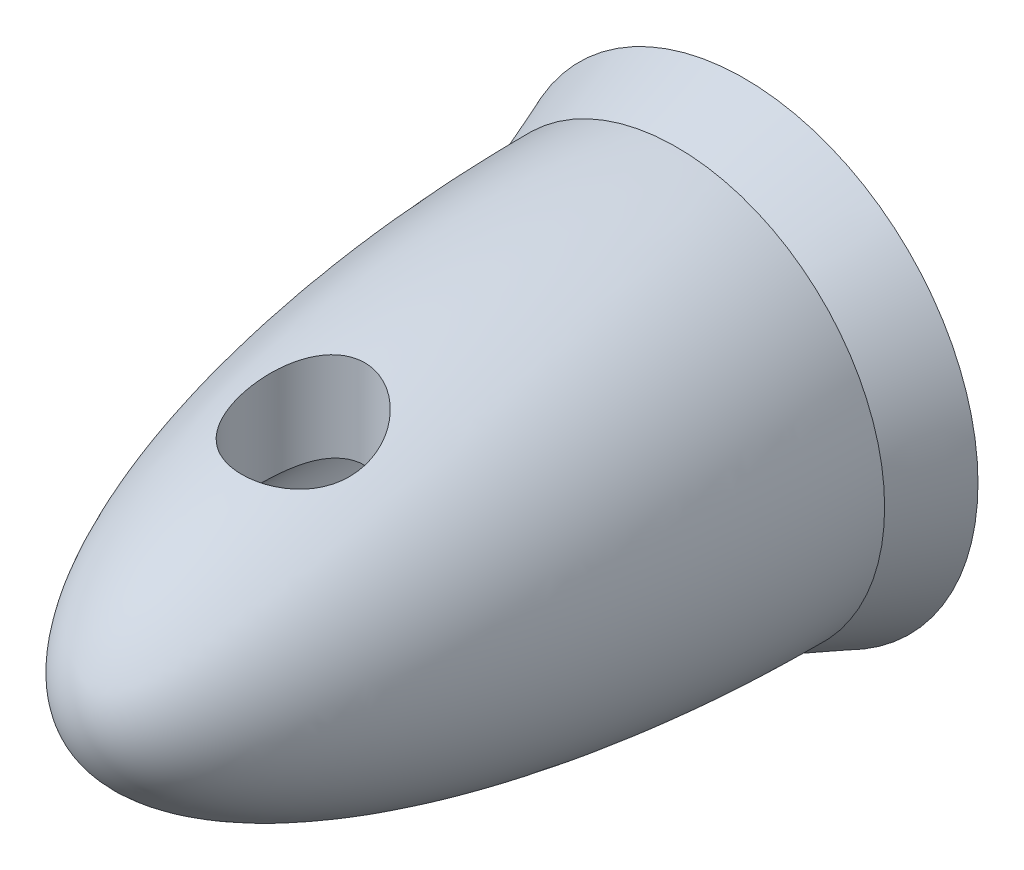
ISO-10303-21;
HEADER;
FILE_DESCRIPTION(('STEP AP214'),'2;1');
FILE_NAME('part.step','',(''),(''),'','','');
FILE_SCHEMA(('AUTOMOTIVE_DESIGN { 1 0 10303 214 1 1 1 1 }'));
ENDSEC;
DATA;
#1=APPLICATION_CONTEXT('core data for automotive mechanical design processes');
#2=APPLICATION_PROTOCOL_DEFINITION('international standard','automotive_design',2000,#1);
#3=PRODUCT_CONTEXT('',#1,'mechanical');
#4=PRODUCT('Part','Part','',(#3));
#5=PRODUCT_RELATED_PRODUCT_CATEGORY('part','',(#4));
#6=PRODUCT_DEFINITION_FORMATION('','',#4);
#7=PRODUCT_DEFINITION_CONTEXT('part definition',#1,'design');
#8=PRODUCT_DEFINITION('design','',#6,#7);
#9=PRODUCT_DEFINITION_SHAPE('','',#8);
#10=(LENGTH_UNIT() NAMED_UNIT(*) SI_UNIT(.MILLI.,.METRE.));
#11=(NAMED_UNIT(*) PLANE_ANGLE_UNIT() SI_UNIT($,.RADIAN.));
#12=(NAMED_UNIT(*) SI_UNIT($,.STERADIAN.) SOLID_ANGLE_UNIT());
#13=UNCERTAINTY_MEASURE_WITH_UNIT(LENGTH_MEASURE(1.E-05),#10,'distance_accuracy_value','');
#14=(GEOMETRIC_REPRESENTATION_CONTEXT(3) GLOBAL_UNCERTAINTY_ASSIGNED_CONTEXT((#13)) GLOBAL_UNIT_ASSIGNED_CONTEXT((#10,
#11,#12)) REPRESENTATION_CONTEXT('',''));
#15=CARTESIAN_POINT('',(0.,0.,0.));
#16=DIRECTION('',(0.,0.,1.));
#17=DIRECTION('',(1.,0.,0.));
#18=AXIS2_PLACEMENT_3D('',#15,#16,#17);
#19=CARTESIAN_POINT('',(0.,-5.8802,11.0998));
#20=DIRECTION('',(0.,1.,0.));
#21=DIRECTION('',(0.,0.,1.));
#22=AXIS2_PLACEMENT_3D('',#19,#20,#21);
#23=CYLINDRICAL_SURFACE('',#22,1.5494);
#24=CARTESIAN_POINT('',(0.,-2.2225,12.6492));
#25=CARTESIAN_POINT('',(0.0771170147032911,-2.22250274735584,12.6492029894743));
#26=CARTESIAN_POINT('',(0.15421870157436,-2.21845361360843,12.6434120716821));
#27=CARTESIAN_POINT('',(0.305938755659869,-2.20266390543856,12.6206318512073));
#28=CARTESIAN_POINT('',(0.380556262324024,-2.19092069423566,12.603638709481));
#29=CARTESIAN_POINT('',(0.524879470134859,-2.16088481343655,12.5595313730395));
#30=CARTESIAN_POINT('',(0.594607037004107,-2.14262386489485,12.5324661711082));
#31=CARTESIAN_POINT('',(0.728199152998337,-2.10098412662809,12.4694088378081));
#32=CARTESIAN_POINT('',(0.792062853926654,-2.07760459816065,12.4334154177686));
#33=CARTESIAN_POINT('',(0.918474233362047,-2.02509220899793,12.3501090592354));
#34=CARTESIAN_POINT('',(0.980410908685875,-1.99563402364824,12.3020784851358));
#35=CARTESIAN_POINT('',(1.09590864070643,-1.93462323976061,12.1978385785166));
#36=CARTESIAN_POINT('',(1.14945695029351,-1.90306755549934,12.1416170443341));
#37=CARTESIAN_POINT('',(1.25624066297551,-1.83467827368051,12.0112793859312));
#38=CARTESIAN_POINT('',(1.30779117464696,-1.79788447718598,11.9357525909791));
#39=CARTESIAN_POINT('',(1.39748918760828,-1.72908067290491,11.7751447630681));
#40=CARTESIAN_POINT('',(1.43565922265104,-1.69706267507141,11.6900801146551));
#41=CARTESIAN_POINT('',(1.48722085116729,-1.65180969579788,11.539175875003));
#42=CARTESIAN_POINT('',(1.5046252740562,-1.635828582297,11.4755408943984));
#43=CARTESIAN_POINT('',(1.53126521925815,-1.61092269960599,11.3452920824815));
#44=CARTESIAN_POINT('',(1.54051655385883,-1.60198427524698,11.2786842816316));
#45=CARTESIAN_POINT('',(1.5502553443447,-1.59256642124469,11.1438295837258));
#46=CARTESIAN_POINT('',(1.55069390265044,-1.59213418837216,11.0755756441042));
#47=CARTESIAN_POINT('',(1.54264193598977,-1.59993385322039,10.9400818702673));
#48=CARTESIAN_POINT('',(1.53414520214767,-1.6081717755841,10.8728427741902));
#49=CARTESIAN_POINT('',(1.509667932058,-1.63115365364257,10.7455687901461));
#50=CARTESIAN_POINT('',(1.49420100999816,-1.64544761456029,10.6853482193836));
#51=CARTESIAN_POINT('',(1.45670569797196,-1.67873267770151,10.5683601114957));
#52=CARTESIAN_POINT('',(1.43467207791442,-1.69772752192241,10.5115953703513));
#53=CARTESIAN_POINT('',(1.3715297612764,-1.74952264863319,10.3731676993877));
#54=CARTESIAN_POINT('',(1.32647625894424,-1.7843404940706,10.2940497865428));
#55=CARTESIAN_POINT('',(1.22389582236907,-1.85621266499247,10.145390065117));
#56=CARTESIAN_POINT('',(1.16634383118288,-1.89327137367421,10.075867958885));
#57=CARTESIAN_POINT('',(1.03882899868236,-1.96616363403802,9.94662957858762));
#58=CARTESIAN_POINT('',(0.968732391082036,-2.00197844714014,9.88703388194611));
#59=CARTESIAN_POINT('',(0.817478343778214,-2.06833804202416,9.78037086851881));
#60=CARTESIAN_POINT('',(0.736344382706881,-2.09889370666812,9.73327756793046));
#61=CARTESIAN_POINT('',(0.583635498281869,-2.1456402453397,9.66263701561687));
#62=CARTESIAN_POINT('',(0.513918959041067,-2.16351363567332,9.63618531807645));
#63=CARTESIAN_POINT('',(0.370127747273022,-2.19268728268332,9.59339399560098));
#64=CARTESIAN_POINT('',(0.296056079612801,-2.20399201420774,9.5770474860984));
#65=CARTESIAN_POINT('',(0.145242222996963,-2.21904776290085,9.55533597186037));
#66=CARTESIAN_POINT('',(0.0684906799491387,-2.22276890849082,9.55001439272634));
#67=CARTESIAN_POINT('',(-0.0849233265514331,-2.22220071663168,9.55082917795614));
#68=CARTESIAN_POINT('',(-0.161585792615044,-2.21791162020994,9.55696519756201));
#69=CARTESIAN_POINT('',(-0.307549914569856,-2.2022646726015,9.57954885931754));
#70=CARTESIAN_POINT('',(-0.377009956662267,-2.19137267079116,9.59531742489817));
#71=CARTESIAN_POINT('',(-0.512055085986602,-2.16380681479868,9.63576025052818));
#72=CARTESIAN_POINT('',(-0.577639449176778,-2.14713188424004,9.66043616853797));
#73=CARTESIAN_POINT('',(-0.708335435790631,-2.10778486168935,9.7197923560651));
#74=CARTESIAN_POINT('',(-0.773070585593601,-2.08476653205376,9.7550666066516));
#75=CARTESIAN_POINT('',(-0.895923380185302,-2.03500095557565,9.83359092141859));
#76=CARTESIAN_POINT('',(-0.954036697811736,-2.00825129552686,9.87684615312085));
#77=CARTESIAN_POINT('',(-1.07246412819102,-1.94793715947481,9.97839732835856));
#78=CARTESIAN_POINT('',(-1.13146202465086,-1.9139886497203,10.0380003066189));
#79=CARTESIAN_POINT('',(-1.23917675769554,-1.84607740859233,10.165946113086));
#80=CARTESIAN_POINT('',(-1.28788595324982,-1.81211468528764,10.2342953767597));
#81=CARTESIAN_POINT('',(-1.36975924887038,-1.75088652332061,10.3717053834742));
#82=CARTESIAN_POINT('',(-1.4040067278097,-1.72329152128733,10.4399704312431));
#83=CARTESIAN_POINT('',(-1.46254443380959,-1.67389987976446,10.582579881039));
#84=CARTESIAN_POINT('',(-1.48685416793899,-1.6520919105798,10.6569120261709));
#85=CARTESIAN_POINT('',(-1.52051787027009,-1.6210962163981,10.7953476844841));
#86=CARTESIAN_POINT('',(-1.5318727916681,-1.61027006948123,10.8585881820952));
#87=CARTESIAN_POINT('',(-1.54661532289652,-1.59611978699779,10.9867909884084));
#88=CARTESIAN_POINT('',(-1.5500127857186,-1.5927863740719,11.0517510669596));
#89=CARTESIAN_POINT('',(-1.54860392303485,-1.59415565405595,11.1815526005078));
#90=CARTESIAN_POINT('',(-1.54378998225525,-1.59886580659084,11.246393889502));
#91=CARTESIAN_POINT('',(-1.52629640069475,-1.6155695374302,11.3740755401818));
#92=CARTESIAN_POINT('',(-1.51360530246867,-1.62757372448263,11.4369128468209));
#93=CARTESIAN_POINT('',(-1.47636052882862,-1.66152435971457,11.576935905243));
#94=CARTESIAN_POINT('',(-1.44944030658933,-1.68534034814961,11.6530286690748));
#95=CARTESIAN_POINT('',(-1.38518410862201,-1.73853602374154,11.7985561296806));
#96=CARTESIAN_POINT('',(-1.34783202463406,-1.76792429256588,11.8679803046093));
#97=CARTESIAN_POINT('',(-1.26271332490164,-1.82972487297364,12.0012356780702));
#98=CARTESIAN_POINT('',(-1.21472401226484,-1.86219175047499,12.0648985484187));
#99=CARTESIAN_POINT('',(-1.10946601828289,-1.92676136421949,12.1842629029324));
#100=CARTESIAN_POINT('',(-1.05219426101847,-1.95886397596998,12.2399617365034));
#101=CARTESIAN_POINT('',(-0.917977600252162,-2.02568020681746,12.3515372835879));
#102=CARTESIAN_POINT('',(-0.839343993893815,-2.05986431615365,12.4057319752667));
#103=CARTESIAN_POINT('',(-0.671167744969847,-2.12061165916992,12.4995871211126));
#104=CARTESIAN_POINT('',(-0.581639750080523,-2.14718496785051,12.5392668093851));
#105=CARTESIAN_POINT('',(-0.410560566217402,-2.18569346735763,12.5960425770877));
#106=CARTESIAN_POINT('',(-0.330307223259771,-2.19936534925841,12.6158574118936));
#107=CARTESIAN_POINT('',(-0.166694204322206,-2.21776206998619,12.642427120274));
#108=CARTESIAN_POINT('',(-0.0833381518515855,-2.22249703101113,12.6491967693606));
#109=CARTESIAN_POINT('',(0.,-2.2225,12.6492));
#110=B_SPLINE_CURVE_WITH_KNOTS('',3,(#24,#25,#26,#27,#28,#29,#30,#31,#32,#33,#34,#35,#36,#37,
#38,#39,#40,#41,#42,#43,#44,#45,#46,#47,#48,#49,#50,#51,#52,#53,#54,#55,#56,#57,#58,#59,#60,#61,
#62,#63,#64,#65,#66,#67,#68,#69,#70,#71,#72,#73,#74,#75,#76,#77,#78,#79,#80,#81,#82,#83,#84,#85,
#86,#87,#88,#89,#90,#91,#92,#93,#94,#95,#96,#97,#98,#99,#100,#101,#102,#103,#104,#105,#106,#107,
#108,#109),.UNSPECIFIED.,.T.,.F.,(4,2,2,2,2,2,2,2,2,2,2,2,2,2,2,2,2,2,2,2,2,2,2,2,2,2,2,2,2,2,2,
2,2,2,2,2,2,2,2,2,2,2,4),(0.,0.23101475453498,0.462108719868971,0.692092980091046,
0.922110454848142,1.17238105520856,1.42302835712061,1.71741004919331,2.01129357085937,
2.21416389079127,2.41663988795183,2.62023901234306,2.82397970540837,3.01468460216281,
3.20554179488864,3.4964381214486,3.7879231105135,4.08272477988537,4.37690887784421,
4.60598590770751,4.83490669709368,5.06472747109976,5.29454132993396,5.50977140439178,
5.72504156114187,5.95586420126587,6.18683682214929,6.45721757828604,6.72779843545371,
6.97055897877779,7.21284068587513,7.40747819089864,7.60187456643702,7.79645132363593,
7.99131176105597,8.24241098704428,8.49390010988842,8.75125810362404,9.0087015529715,
9.31129577560797,9.61348755981758,9.86342184944642,10.1130728864772),.UNSPECIFIED.);
#111=CARTESIAN_POINT('',(0.,-2.2225,12.6492));
#112=VERTEX_POINT('',#111);
#113=EDGE_CURVE('E41',#112,#112,#110,.T.);
#114=ORIENTED_EDGE('',*,*,#113,.T.);
#115=EDGE_LOOP('',(#114));
#116=FACE_BOUND('',#115,.T.);
#117=CARTESIAN_POINT('',(0.,-3.57322495631313,12.6492));
#118=CARTESIAN_POINT('',(-0.0870657425102343,-3.57322371714071,12.6491982283351));
#119=CARTESIAN_POINT('',(-0.174150938474675,-3.57276235523512,12.6418411087649));
#120=CARTESIAN_POINT('',(-0.345869479929163,-3.57116369774129,12.6126140773961));
#121=CARTESIAN_POINT('',(-0.430501805618271,-3.57002612512371,12.5907382171456));
#122=CARTESIAN_POINT('',(-0.594884287338493,-3.56779544675727,12.5330958365612));
#123=CARTESIAN_POINT('',(-0.674635206419172,-3.56670233406755,12.4973314936932));
#124=CARTESIAN_POINT('',(-0.827008845724925,-3.56565319591999,12.4129190888639));
#125=CARTESIAN_POINT('',(-0.899631905239484,-3.56569711631244,12.3642716405525));
#126=CARTESIAN_POINT('',(-1.035505810166,-3.56823181765649,12.2556183233574));
#127=CARTESIAN_POINT('',(-1.09877793268183,-3.57071694211447,12.1956389710008));
#128=CARTESIAN_POINT('',(-1.21427049328795,-3.57942927797167,12.0660881883549));
#129=CARTESIAN_POINT('',(-1.26649391206294,-3.58565547837013,11.996519353472));
#130=CARTESIAN_POINT('',(-1.35728546284093,-3.60266970298124,11.8518218246459));
#131=CARTESIAN_POINT('',(-1.39615070244299,-3.61334489188594,11.7768662093043));
#132=CARTESIAN_POINT('',(-1.46100173442307,-3.63970717725518,11.6224176625845));
#133=CARTESIAN_POINT('',(-1.48698864784396,-3.65539383728158,11.5429251268117));
#134=CARTESIAN_POINT('',(-1.52554628638394,-3.69146259036318,11.3827571129202));
#135=CARTESIAN_POINT('',(-1.53825827984379,-3.71179237615848,11.3021035484572));
#136=CARTESIAN_POINT('',(-1.55096239672796,-3.75661571518479,11.1409652476928));
#137=CARTESIAN_POINT('',(-1.55095103186348,-3.78111040844375,11.0604805637406));
#138=CARTESIAN_POINT('',(-1.53838001516196,-3.83478026887728,10.8970130083193));
#139=CARTESIAN_POINT('',(-1.52510972016746,-3.86414194851526,10.814146812385));
#140=CARTESIAN_POINT('',(-1.48572949818195,-3.9250971876328,10.6523715714356));
#141=CARTESIAN_POINT('',(-1.45961112118355,-3.95669220422115,10.5734651684111));
#142=CARTESIAN_POINT('',(-1.3923015372826,-4.02363924035142,10.4140242979276));
#143=CARTESIAN_POINT('',(-1.34994464667845,-4.0590694740704,10.3340079742283));
#144=CARTESIAN_POINT('',(-1.27636384559038,-4.11143016388857,10.22026662147));
#145=CARTESIAN_POINT('',(-1.25015553337019,-4.12875681814367,10.1833923219999));
#146=CARTESIAN_POINT('',(-1.19444494899666,-4.16294389560709,10.111873167909));
#147=CARTESIAN_POINT('',(-1.1649370977509,-4.1798034671132,10.0772322504152));
#148=CARTESIAN_POINT('',(-1.06992818667016,-4.2301972972998,9.97521734213464));
#149=CARTESIAN_POINT('',(-0.999314314726635,-4.26254596372153,9.91189235281612));
#150=CARTESIAN_POINT('',(-0.846206148490757,-4.32173378013175,9.79840739871169));
#151=CARTESIAN_POINT('',(-0.763726454028966,-4.34857960385902,9.74823146618639));
#152=CARTESIAN_POINT('',(-0.636589290852903,-4.38203528163978,9.68651495872825));
#153=CARTESIAN_POINT('',(-0.595656046703005,-4.39172767304995,9.6687721638489));
#154=CARTESIAN_POINT('',(-0.512091074724047,-4.40928906235165,9.63678952230051));
#155=CARTESIAN_POINT('',(-0.469460853675899,-4.41715963733787,9.62254664518906));
#156=CARTESIAN_POINT('',(-0.382846482159238,-4.43090201926934,9.59776927193537));
#157=CARTESIAN_POINT('',(-0.338863135951063,-4.43677498943065,9.58723261751723));
#158=CARTESIAN_POINT('',(-0.249926282637124,-4.44639258993522,9.57001821432467));
#159=CARTESIAN_POINT('',(-0.204972715756699,-4.450137088754,9.56334070401764));
#160=CARTESIAN_POINT('',(-0.0804871503372814,-4.45737044467275,9.55044905596484));
#161=CARTESIAN_POINT('',(-0.000340373355667604,-4.45855545534211,9.54834895930387));
#162=CARTESIAN_POINT('',(0.159056818103126,-4.45396482337807,9.55651833401618));
#163=CARTESIAN_POINT('',(0.238307440636948,-4.44819083132996,9.56678487218355));
#164=CARTESIAN_POINT('',(0.390112965704788,-4.43054488532722,9.59840225664568));
#165=CARTESIAN_POINT('',(0.462808917411335,-4.41895524205987,9.61924039659329));
#166=CARTESIAN_POINT('',(0.603510453503266,-4.39059086607181,9.67080217296418));
#167=CARTESIAN_POINT('',(0.671515156368486,-4.37381516208079,9.70152766118165));
#168=CARTESIAN_POINT('',(0.805528004733461,-4.33486520854748,9.77393471057213));
#169=CARTESIAN_POINT('',(0.871154660432314,-4.31242191930801,9.81617488973231));
#170=CARTESIAN_POINT('',(0.994652733701842,-4.26395429963402,9.90929410040397));
#171=CARTESIAN_POINT('',(1.05250762831178,-4.23792257076366,9.9601910319563));
#172=CARTESIAN_POINT('',(1.16582010823334,-4.18036059556373,10.0756937084806));
#173=CARTESIAN_POINT('',(1.22020620702656,-4.14854333486564,10.1412065463213));
#174=CARTESIAN_POINT('',(1.31737697193233,-4.08365386416238,10.2798454364498));
#175=CARTESIAN_POINT('',(1.36015585903543,-4.05058103834187,10.352975256105));
#176=CARTESIAN_POINT('',(1.4167023341895,-3.99974056247971,10.4707309311327));
#177=CARTESIAN_POINT('',(1.43483093668129,-3.98183025439685,10.51325254105));
#178=CARTESIAN_POINT('',(1.4672453865491,-3.94638818068051,10.5998326391981));
#179=CARTESIAN_POINT('',(1.48153481139354,-3.92885607673659,10.6438896531296));
#180=CARTESIAN_POINT('',(1.51846884698336,-3.87716394602977,10.7780988265104));
#181=CARTESIAN_POINT('',(1.53519418991107,-3.84389445489413,10.8703202153024));
#182=CARTESIAN_POINT('',(1.5515945814685,-3.78206177286273,11.0567042250796));
#183=CARTESIAN_POINT('',(1.55144999248915,-3.75345207207673,11.1508355541734));
#184=CARTESIAN_POINT('',(1.53372358184106,-3.70205018035763,11.3390496415242));
#185=CARTESIAN_POINT('',(1.51615645920367,-3.67925310581307,11.4331323738364));
#186=CARTESIAN_POINT('',(1.46587049908742,-3.64211561836104,11.6091735810793));
#187=CARTESIAN_POINT('',(1.43469467526269,-3.62719006177378,11.691451067645));
#188=CARTESIAN_POINT('',(1.35843659362796,-3.60276006908575,11.8501545802294));
#189=CARTESIAN_POINT('',(1.31335802549715,-3.59325419654784,11.9265821520603));
#190=CARTESIAN_POINT('',(1.21350633537688,-3.57931896462988,12.0667687855407));
#191=CARTESIAN_POINT('',(1.15943006702319,-3.57463172022213,12.1310010514709));
#192=CARTESIAN_POINT('',(1.04152287178777,-3.56836857257913,12.2499672349784));
#193=CARTESIAN_POINT('',(0.977690605216209,-3.56679309706506,12.3046998458591));
#194=CARTESIAN_POINT('',(0.841014604734947,-3.56555456074588,12.4038589794913));
#195=CARTESIAN_POINT('',(0.768051898965836,-3.5659200343969,12.4481216796306));
#196=CARTESIAN_POINT('',(0.615881745773825,-3.56744312313912,12.5240744157949));
#197=CARTESIAN_POINT('',(0.53667601316852,-3.56860052137291,12.5557678899739));
#198=CARTESIAN_POINT('',(0.381780353955108,-3.57066561012959,12.6034033868951));
#199=CARTESIAN_POINT('',(0.306456262698348,-3.57158653627487,12.6205429444522));
#200=CARTESIAN_POINT('',(0.154093203945481,-3.57286676033807,12.6434420882719));
#201=CARTESIAN_POINT('',(0.0770542203938847,-3.5732260529955,12.6492015679446));
#202=CARTESIAN_POINT('',(0.,-3.57322495631313,12.6492));
#203=B_SPLINE_CURVE_WITH_KNOTS('',3,(#117,#118,#119,#120,#121,#122,#123,#124,#125,#126,#127,
#128,#129,#130,#131,#132,#133,#134,#135,#136,#137,#138,#139,#140,#141,#142,#143,#144,#145,#146,
#147,#148,#149,#150,#151,#152,#153,#154,#155,#156,#157,#158,#159,#160,#161,#162,#163,#164,#165,
#166,#167,#168,#169,#170,#171,#172,#173,#174,#175,#176,#177,#178,#179,#180,#181,#182,#183,#184,
#185,#186,#187,#188,#189,#190,#191,#192,#193,#194,#195,#196,#197,#198,#199,#200,#201,#202),
.UNSPECIFIED.,.T.,.F.,(4,2,2,2,2,2,2,2,2,2,2,2,2,2,2,2,2,2,2,2,2,2,2,2,2,2,2,2,2,2,2,2,2,2,2,2,
2,2,2,2,2,2,4),(0.,0.260922222303919,0.521951412711629,0.782939694914795,1.0439155479212,
1.30428811890238,1.56459035756352,1.81865791502128,2.07270335231595,2.32401686401857,
2.57539927689497,2.84101888054147,3.10681341259556,3.39706231772578,3.54225310960782,
3.68769322252171,3.98666696904997,4.28527595238656,4.42207183307865,4.55874884685422,
4.69534613606614,4.83195186510734,5.07114753067058,5.31028647328401,5.53880118760712,
5.76735872521647,6.01000540470707,6.25316005731562,6.52474893397971,6.7964727824758,
6.94503634679468,7.09346099088576,7.39020034609319,7.68376745001198,7.97708708794901,
8.24341545161626,8.50967319456043,8.76079368517794,9.01194869059597,9.2668061264063,
9.52159380100302,9.7525109164336,9.98343019471006),.UNSPECIFIED.);
#204=CARTESIAN_POINT('',(0.,-3.57322495631313,12.6492));
#205=VERTEX_POINT('',#204);
#206=EDGE_CURVE('E115',#205,#205,#203,.T.);
#207=ORIENTED_EDGE('',*,*,#206,.T.);
#208=EDGE_LOOP('',(#207));
#209=FACE_BOUND('',#208,.T.);
#210=ADVANCED_FACE('F35',(#116,#209),#23,.F.);
#211=CARTESIAN_POINT('',(0.,0.,0.));
#212=DIRECTION('',(0.,0.,1.));
#213=DIRECTION('',(1.,0.,0.));
#214=AXIS2_PLACEMENT_3D('',#211,#212,#213);
#215=PLANE('',#214);
#216=CARTESIAN_POINT('',(0.,0.,0.));
#217=DIRECTION('',(0.,0.,-1.));
#218=DIRECTION('',(-1.,0.,0.));
#219=AXIS2_PLACEMENT_3D('',#216,#217,#218);
#220=CIRCLE('',#219,2.2225);
#221=CARTESIAN_POINT('',(-2.2225,0.,0.));
#222=VERTEX_POINT('',#221);
#223=EDGE_CURVE('E161',#222,#222,#220,.T.);
#224=ORIENTED_EDGE('',*,*,#223,.F.);
#225=EDGE_LOOP('',(#224));
#226=FACE_BOUND('',#225,.T.);
#227=CARTESIAN_POINT('',(0.,0.,0.));
#228=DIRECTION('',(0.,0.,1.));
#229=DIRECTION('',(1.,0.,0.));
#230=AXIS2_PLACEMENT_3D('',#227,#228,#229);
#231=CIRCLE('',#230,5.8801);
#232=CARTESIAN_POINT('',(5.8801,0.,0.));
#233=VERTEX_POINT('',#232);
#234=EDGE_CURVE('E49',#233,#233,#231,.T.);
#235=ORIENTED_EDGE('',*,*,#234,.F.);
#236=EDGE_LOOP('',(#235));
#237=FACE_BOUND('',#236,.T.);
#238=ADVANCED_FACE('F55',(#226,#237),#215,.F.);
#239=CARTESIAN_POINT('',(0.,0.,1.7018));
#240=DIRECTION('',(0.,1.,0.));
#241=DIRECTION('',(0.,0.,1.));
#242=AXIS2_PLACEMENT_3D('',#239,#240,#241);
#243=ELLIPSE('',#242,14.986,5.2324);
#244=TRIMMED_CURVE('',#243,(PARAMETER_VALUE(0.)),(PARAMETER_VALUE(3.14159265358979)),.T.,.PARAMETER.);
#245=CARTESIAN_POINT('',(0.,0.,-13.2842));
#246=DIRECTION('',(0.,0.,1.));
#247=AXIS1_PLACEMENT('',#245,#246);
#248=SURFACE_OF_REVOLUTION('',#244,#247);
#249=ORIENTED_EDGE('',*,*,#206,.F.);
#250=EDGE_LOOP('',(#249));
#251=FACE_BOUND('',#250,.T.);
#252=CARTESIAN_POINT('',(0.,3.57322495631313,12.6492));
#253=CARTESIAN_POINT('',(0.0870657425102375,3.57322371714071,12.6491982283351));
#254=CARTESIAN_POINT('',(0.174150938474679,3.57276235523512,12.6418411087649));
#255=CARTESIAN_POINT('',(0.345869479929167,3.57116369774129,12.6126140773961));
#256=CARTESIAN_POINT('',(0.430501805618274,3.57002612512371,12.5907382171456));
#257=CARTESIAN_POINT('',(0.594884287338496,3.56779544675727,12.5330958365612));
#258=CARTESIAN_POINT('',(0.674635206419174,3.56670233406755,12.4973314936932));
#259=CARTESIAN_POINT('',(0.827008845724927,3.56565319591999,12.4129190888639));
#260=CARTESIAN_POINT('',(0.899631905239487,3.56569711631244,12.3642716405525));
#261=CARTESIAN_POINT('',(1.035505810166,3.56823181765648,12.2556183233574));
#262=CARTESIAN_POINT('',(1.09877793268183,3.57071694211447,12.1956389710008));
#263=CARTESIAN_POINT('',(1.21427049328795,3.57942927797167,12.0660881883549));
#264=CARTESIAN_POINT('',(1.26649391206295,3.58565547837013,11.996519353472));
#265=CARTESIAN_POINT('',(1.35728546284094,3.60266970298124,11.8518218246459));
#266=CARTESIAN_POINT('',(1.39615070244299,3.61334489188594,11.7768662093043));
#267=CARTESIAN_POINT('',(1.46100173442307,3.63970717725518,11.6224176625845));
#268=CARTESIAN_POINT('',(1.48698864784397,3.65539383728158,11.5429251268117));
#269=CARTESIAN_POINT('',(1.52554628638394,3.69146259036318,11.3827571129202));
#270=CARTESIAN_POINT('',(1.53825827984379,3.71179237615848,11.3021035484572));
#271=CARTESIAN_POINT('',(1.55096239672796,3.75661571518479,11.1409652476928));
#272=CARTESIAN_POINT('',(1.55095103186349,3.78111040844375,11.0604805637406));
#273=CARTESIAN_POINT('',(1.53838001516197,3.83478026887728,10.8970130083193));
#274=CARTESIAN_POINT('',(1.52510972016746,3.86414194851526,10.814146812385));
#275=CARTESIAN_POINT('',(1.48572949818195,3.9250971876328,10.6523715714356));
#276=CARTESIAN_POINT('',(1.45961112118355,3.95669220422115,10.5734651684111));
#277=CARTESIAN_POINT('',(1.3923015372826,4.02363924035142,10.4140242979276));
#278=CARTESIAN_POINT('',(1.34994464667845,4.0590694740704,10.3340079742283));
#279=CARTESIAN_POINT('',(1.27636384559038,4.11143016388857,10.22026662147));
#280=CARTESIAN_POINT('',(1.25015553337019,4.12875681814367,10.1833923219999));
#281=CARTESIAN_POINT('',(1.19444494899666,4.16294389560709,10.111873167909));
#282=CARTESIAN_POINT('',(1.16493709775091,4.1798034671132,10.0772322504152));
#283=CARTESIAN_POINT('',(1.06992818667016,4.2301972972998,9.97521734213464));
#284=CARTESIAN_POINT('',(0.999314314726638,4.26254596372153,9.91189235281612));
#285=CARTESIAN_POINT('',(0.846206148490761,4.32173378013175,9.79840739871169));
#286=CARTESIAN_POINT('',(0.76372645402897,4.34857960385902,9.74823146618639));
#287=CARTESIAN_POINT('',(0.636589290852907,4.38203528163978,9.68651495872825));
#288=CARTESIAN_POINT('',(0.595656046703009,4.39172767304995,9.6687721638489));
#289=CARTESIAN_POINT('',(0.512091074724051,4.40928906235165,9.63678952230051));
#290=CARTESIAN_POINT('',(0.469460853675903,4.41715963733787,9.62254664518906));
#291=CARTESIAN_POINT('',(0.382846482159242,4.43090201926934,9.59776927193537));
#292=CARTESIAN_POINT('',(0.338863135951067,4.43677498943065,9.58723261751723));
#293=CARTESIAN_POINT('',(0.249926282637127,4.44639258993522,9.57001821432467));
#294=CARTESIAN_POINT('',(0.204972715756702,4.450137088754,9.56334070401764));
#295=CARTESIAN_POINT('',(0.0804871503372851,4.45737044467275,9.55044905596484));
#296=CARTESIAN_POINT('',(0.000340373355671547,4.45855545534211,9.54834895930387));
#297=CARTESIAN_POINT('',(-0.159056818103121,4.45396482337807,9.55651833401618));
#298=CARTESIAN_POINT('',(-0.238307440636943,4.44819083132996,9.56678487218355));
#299=CARTESIAN_POINT('',(-0.390112965704783,4.43054488532722,9.59840225664568));
#300=CARTESIAN_POINT('',(-0.462808917411331,4.41895524205987,9.61924039659328));
#301=CARTESIAN_POINT('',(-0.603510453503261,4.39059086607181,9.67080217296418));
#302=CARTESIAN_POINT('',(-0.67151515636848,4.37381516208079,9.70152766118165));
#303=CARTESIAN_POINT('',(-0.805528004733455,4.33486520854749,9.77393471057213));
#304=CARTESIAN_POINT('',(-0.871154660432309,4.31242191930801,9.81617488973231));
#305=CARTESIAN_POINT('',(-0.994652733701838,4.26395429963402,9.90929410040397));
#306=CARTESIAN_POINT('',(-1.05250762831178,4.23792257076366,9.9601910319563));
#307=CARTESIAN_POINT('',(-1.16582010823334,4.18036059556373,10.0756937084806));
#308=CARTESIAN_POINT('',(-1.22020620702656,4.14854333486564,10.1412065463213));
#309=CARTESIAN_POINT('',(-1.31737697193233,4.08365386416238,10.2798454364498));
#310=CARTESIAN_POINT('',(-1.36015585903543,4.05058103834187,10.352975256105));
#311=CARTESIAN_POINT('',(-1.41670233418949,3.99974056247971,10.4707309311327));
#312=CARTESIAN_POINT('',(-1.43483093668128,3.98183025439686,10.51325254105));
#313=CARTESIAN_POINT('',(-1.4672453865491,3.94638818068052,10.5998326391981));
#314=CARTESIAN_POINT('',(-1.48153481139354,3.9288560767366,10.6438896531296));
#315=CARTESIAN_POINT('',(-1.51846884698336,3.87716394602977,10.7780988265104));
#316=CARTESIAN_POINT('',(-1.53519418991107,3.84389445489413,10.8703202153024));
#317=CARTESIAN_POINT('',(-1.55159458146849,3.78206177286273,11.0567042250796));
#318=CARTESIAN_POINT('',(-1.55144999248915,3.75345207207673,11.1508355541734));
#319=CARTESIAN_POINT('',(-1.53372358184105,3.70205018035764,11.3390496415242));
#320=CARTESIAN_POINT('',(-1.51615645920367,3.67925310581307,11.4331323738364));
#321=CARTESIAN_POINT('',(-1.46587049908741,3.64211561836104,11.6091735810793));
#322=CARTESIAN_POINT('',(-1.43469467526269,3.62719006177378,11.691451067645));
#323=CARTESIAN_POINT('',(-1.35843659362795,3.60276006908575,11.8501545802294));
#324=CARTESIAN_POINT('',(-1.31335802549714,3.59325419654784,11.9265821520603));
#325=CARTESIAN_POINT('',(-1.21350633537688,3.57931896462988,12.0667687855407));
#326=CARTESIAN_POINT('',(-1.15943006702319,3.57463172022213,12.1310010514709));
#327=CARTESIAN_POINT('',(-1.04152287178777,3.56836857257913,12.2499672349784));
#328=CARTESIAN_POINT('',(-0.977690605216209,3.56679309706506,12.3046998458591));
#329=CARTESIAN_POINT('',(-0.841014604734947,3.56555456074588,12.4038589794913));
#330=CARTESIAN_POINT('',(-0.768051898965835,3.5659200343969,12.4481216796306));
#331=CARTESIAN_POINT('',(-0.615881745773823,3.56744312313912,12.5240744157949));
#332=CARTESIAN_POINT('',(-0.536676013168517,3.56860052137291,12.5557678899739));
#333=CARTESIAN_POINT('',(-0.381780353955105,3.57066561012959,12.6034033868951));
#334=CARTESIAN_POINT('',(-0.306456262698345,3.57158653627487,12.6205429444522));
#335=CARTESIAN_POINT('',(-0.154093203945477,3.57286676033807,12.6434420882719));
#336=CARTESIAN_POINT('',(-0.0770542203938813,3.5732260529955,12.6492015679446));
#337=CARTESIAN_POINT('',(0.,3.57322495631313,12.6492));
#338=B_SPLINE_CURVE_WITH_KNOTS('',3,(#252,#253,#254,#255,#256,#257,#258,#259,#260,#261,#262,
#263,#264,#265,#266,#267,#268,#269,#270,#271,#272,#273,#274,#275,#276,#277,#278,#279,#280,#281,
#282,#283,#284,#285,#286,#287,#288,#289,#290,#291,#292,#293,#294,#295,#296,#297,#298,#299,#300,
#301,#302,#303,#304,#305,#306,#307,#308,#309,#310,#311,#312,#313,#314,#315,#316,#317,#318,#319,
#320,#321,#322,#323,#324,#325,#326,#327,#328,#329,#330,#331,#332,#333,#334,#335,#336,#337),
.UNSPECIFIED.,.T.,.F.,(4,2,2,2,2,2,2,2,2,2,2,2,2,2,2,2,2,2,2,2,2,2,2,2,2,2,2,2,2,2,2,2,2,2,2,2,
2,2,2,2,2,2,4),(0.,0.260922222303919,0.521951412711629,0.782939694914795,1.0439155479212,
1.30428811890238,1.56459035756352,1.81865791502128,2.07270335231595,2.32401686401857,
2.57539927689497,2.84101888054147,3.10681341259556,3.39706231772578,3.54225310960782,
3.68769322252171,3.98666696904997,4.28527595238656,4.42207183307865,4.55874884685422,
4.69534613606614,4.83195186510734,5.07114753067058,5.31028647328401,5.53880118760712,
5.76735872521647,6.01000540470707,6.25316005731562,6.5247489339797,6.7964727824758,
6.94503634679467,7.09346099088576,7.39020034609319,7.68376745001198,7.97708708794901,
8.24341545161626,8.50967319456043,8.76079368517794,9.01194869059597,9.2668061264063,
9.52159380100303,9.7525109164336,9.98343019471006),.UNSPECIFIED.);
#339=CARTESIAN_POINT('',(0.,3.57322495631313,12.6492));
#340=VERTEX_POINT('',#339);
#341=EDGE_CURVE('E78',#340,#340,#338,.T.);
#342=ORIENTED_EDGE('',*,*,#341,.F.);
#343=EDGE_LOOP('',(#342));
#344=FACE_BOUND('',#343,.T.);
#345=CARTESIAN_POINT('',(0.,0.,16.6878));
#346=VERTEX_POINT('',#345);
#347=VERTEX_LOOP('',#346);
#348=FACE_BOUND('',#347,.T.);
#349=CARTESIAN_POINT('',(0.,0.,1.7018));
#350=DIRECTION('',(0.,0.,1.));
#351=DIRECTION('',(1.,0.,0.));
#352=AXIS2_PLACEMENT_3D('',#349,#350,#351);
#353=CIRCLE('',#352,5.2324);
#354=CARTESIAN_POINT('',(5.2324,0.,1.7018));
#355=VERTEX_POINT('',#354);
#356=EDGE_CURVE('E12',#355,#355,#353,.T.);
#357=ORIENTED_EDGE('',*,*,#356,.T.);
#358=EDGE_LOOP('',(#357));
#359=FACE_BOUND('',#358,.T.);
#360=ADVANCED_FACE('F37',(#251,#344,#348,#359),#248,.F.);
#361=CARTESIAN_POINT('',(0.,0.,1.7018));
#362=DIRECTION('',(0.,0.,-1.));
#363=DIRECTION('',(-1.,0.,0.));
#364=AXIS2_PLACEMENT_3D('',#361,#362,#363);
#365=CONICAL_SURFACE('',#364,5.2324,0.363668590287455);
#366=ORIENTED_EDGE('',*,*,#356,.F.);
#367=EDGE_LOOP('',(#366));
#368=FACE_BOUND('',#367,.T.);
#369=ORIENTED_EDGE('',*,*,#234,.T.);
#370=EDGE_LOOP('',(#369));
#371=FACE_BOUND('',#370,.T.);
#372=ADVANCED_FACE('F54',(#368,#371),#365,.T.);
#373=CARTESIAN_POINT('',(0.,2.2225,12.6492));
#374=CARTESIAN_POINT('',(-0.0771170147032882,2.22250274735584,12.6492029894743));
#375=CARTESIAN_POINT('',(-0.154218701574358,2.21845361360843,12.6434120716821));
#376=CARTESIAN_POINT('',(-0.305938755659866,2.20266390543856,12.6206318512073));
#377=CARTESIAN_POINT('',(-0.380556262324021,2.19092069423566,12.603638709481));
#378=CARTESIAN_POINT('',(-0.524879470134856,2.16088481343655,12.5595313730395));
#379=CARTESIAN_POINT('',(-0.594607037004104,2.14262386489485,12.5324661711082));
#380=CARTESIAN_POINT('',(-0.728199152998334,2.10098412662809,12.4694088378081));
#381=CARTESIAN_POINT('',(-0.792062853926651,2.07760459816065,12.4334154177686));
#382=CARTESIAN_POINT('',(-0.918474233362043,2.02509220899793,12.3501090592355));
#383=CARTESIAN_POINT('',(-0.980410908685871,1.99563402364824,12.3020784851358));
#384=CARTESIAN_POINT('',(-1.09590864070642,1.93462323976061,12.1978385785166));
#385=CARTESIAN_POINT('',(-1.1494569502935,1.90306755549934,12.1416170443341));
#386=CARTESIAN_POINT('',(-1.2562406629755,1.83467827368051,12.0112793859312));
#387=CARTESIAN_POINT('',(-1.30779117464696,1.79788447718598,11.9357525909791));
#388=CARTESIAN_POINT('',(-1.39748918760828,1.72908067290491,11.7751447630681));
#389=CARTESIAN_POINT('',(-1.43565922265103,1.69706267507141,11.6900801146551));
#390=CARTESIAN_POINT('',(-1.48722085116728,1.65180969579788,11.539175875003));
#391=CARTESIAN_POINT('',(-1.5046252740562,1.635828582297,11.4755408943984));
#392=CARTESIAN_POINT('',(-1.53126521925815,1.610922699606,11.3452920824815));
#393=CARTESIAN_POINT('',(-1.54051655385882,1.60198427524699,11.2786842816316));
#394=CARTESIAN_POINT('',(-1.55025534434469,1.5925664212447,11.1438295837258));
#395=CARTESIAN_POINT('',(-1.55069390265044,1.59213418837216,11.0755756441042));
#396=CARTESIAN_POINT('',(-1.54264193598976,1.5999338532204,10.9400818702673));
#397=CARTESIAN_POINT('',(-1.53414520214767,1.6081717755841,10.8728427741902));
#398=CARTESIAN_POINT('',(-1.509667932058,1.63115365364257,10.7455687901461));
#399=CARTESIAN_POINT('',(-1.49420100999816,1.64544761456029,10.6853482193836));
#400=CARTESIAN_POINT('',(-1.45670569797196,1.67873267770151,10.5683601114957));
#401=CARTESIAN_POINT('',(-1.43467207791442,1.69772752192241,10.5115953703513));
#402=CARTESIAN_POINT('',(-1.3715297612764,1.74952264863319,10.3731676993877));
#403=CARTESIAN_POINT('',(-1.32647625894424,1.78434049407061,10.2940497865428));
#404=CARTESIAN_POINT('',(-1.22389582236907,1.85621266499247,10.145390065117));
#405=CARTESIAN_POINT('',(-1.16634383118288,1.89327137367421,10.075867958885));
#406=CARTESIAN_POINT('',(-1.03882899868235,1.96616363403802,9.94662957858762));
#407=CARTESIAN_POINT('',(-0.968732391082034,2.00197844714015,9.88703388194611));
#408=CARTESIAN_POINT('',(-0.817478343778212,2.06833804202416,9.78037086851881));
#409=CARTESIAN_POINT('',(-0.736344382706879,2.09889370666812,9.73327756793046));
#410=CARTESIAN_POINT('',(-0.583635498281867,2.1456402453397,9.66263701561687));
#411=CARTESIAN_POINT('',(-0.513918959041065,2.16351363567332,9.63618531807645));
#412=CARTESIAN_POINT('',(-0.370127747273019,2.19268728268332,9.59339399560098));
#413=CARTESIAN_POINT('',(-0.296056079612799,2.20399201420774,9.5770474860984));
#414=CARTESIAN_POINT('',(-0.145242222996961,2.21904776290085,9.55533597186037));
#415=CARTESIAN_POINT('',(-0.0684906799491365,2.22276890849082,9.55001439272634));
#416=CARTESIAN_POINT('',(0.0849233265514353,2.22220071663168,9.55082917795614));
#417=CARTESIAN_POINT('',(0.161585792615046,2.21791162020994,9.55696519756201));
#418=CARTESIAN_POINT('',(0.307549914569858,2.2022646726015,9.57954885931754));
#419=CARTESIAN_POINT('',(0.377009956662269,2.19137267079116,9.59531742489817));
#420=CARTESIAN_POINT('',(0.512055085986604,2.16380681479868,9.63576025052818));
#421=CARTESIAN_POINT('',(0.57763944917678,2.14713188424004,9.66043616853797));
#422=CARTESIAN_POINT('',(0.708335435790633,2.10778486168934,9.71979235606509));
#423=CARTESIAN_POINT('',(0.773070585593602,2.08476653205376,9.7550666066516));
#424=CARTESIAN_POINT('',(0.895923380185303,2.03500095557565,9.83359092141859));
#425=CARTESIAN_POINT('',(0.954036697811737,2.00825129552685,9.87684615312085));
#426=CARTESIAN_POINT('',(1.07246412819102,1.9479371594748,9.97839732835855));
#427=CARTESIAN_POINT('',(1.13146202465087,1.91398864972029,10.0380003066189));
#428=CARTESIAN_POINT('',(1.23917675769555,1.84607740859232,10.165946113086));
#429=CARTESIAN_POINT('',(1.28788595324982,1.81211468528764,10.2342953767597));
#430=CARTESIAN_POINT('',(1.36975924887038,1.75088652332061,10.3717053834742));
#431=CARTESIAN_POINT('',(1.4040067278097,1.72329152128733,10.4399704312431));
#432=CARTESIAN_POINT('',(1.46254443380959,1.67389987976445,10.5825798810389));
#433=CARTESIAN_POINT('',(1.48685416793899,1.6520919105798,10.6569120261709));
#434=CARTESIAN_POINT('',(1.52051787027009,1.6210962163981,10.7953476844841));
#435=CARTESIAN_POINT('',(1.5318727916681,1.61027006948122,10.8585881820952));
#436=CARTESIAN_POINT('',(1.54661532289652,1.59611978699779,10.9867909884084));
#437=CARTESIAN_POINT('',(1.5500127857186,1.59278637407189,11.0517510669596));
#438=CARTESIAN_POINT('',(1.54860392303485,1.59415565405594,11.1815526005078));
#439=CARTESIAN_POINT('',(1.54378998225525,1.59886580659083,11.2463938895019));
#440=CARTESIAN_POINT('',(1.52629640069476,1.6155695374302,11.3740755401818));
#441=CARTESIAN_POINT('',(1.51360530246868,1.62757372448262,11.4369128468209));
#442=CARTESIAN_POINT('',(1.47636052882863,1.66152435971457,11.576935905243));
#443=CARTESIAN_POINT('',(1.44944030658934,1.6853403481496,11.6530286690748));
#444=CARTESIAN_POINT('',(1.38518410862201,1.73853602374154,11.7985561296806));
#445=CARTESIAN_POINT('',(1.34783202463406,1.76792429256587,11.8679803046093));
#446=CARTESIAN_POINT('',(1.26271332490165,1.82972487297364,12.0012356780702));
#447=CARTESIAN_POINT('',(1.21472401226485,1.86219175047499,12.0648985484187));
#448=CARTESIAN_POINT('',(1.1094660182829,1.92676136421948,12.1842629029324));
#449=CARTESIAN_POINT('',(1.05219426101848,1.95886397596998,12.2399617365034));
#450=CARTESIAN_POINT('',(0.917977600252171,2.02568020681746,12.3515372835879));
#451=CARTESIAN_POINT('',(0.839343993893825,2.05986431615364,12.4057319752667));
#452=CARTESIAN_POINT('',(0.671167744969857,2.12061165916992,12.4995871211125));
#453=CARTESIAN_POINT('',(0.581639750080532,2.14718496785051,12.5392668093851));
#454=CARTESIAN_POINT('',(0.410560566217411,2.18569346735763,12.5960425770877));
#455=CARTESIAN_POINT('',(0.330307223259779,2.1993653492584,12.6158574118936));
#456=CARTESIAN_POINT('',(0.166694204322212,2.21776206998619,12.642427120274));
#457=CARTESIAN_POINT('',(0.0833381518515904,2.22249703101113,12.6491967693606));
#458=CARTESIAN_POINT('',(0.,2.2225,12.6492));
#459=B_SPLINE_CURVE_WITH_KNOTS('',3,(#373,#374,#375,#376,#377,#378,#379,#380,#381,#382,#383,
#384,#385,#386,#387,#388,#389,#390,#391,#392,#393,#394,#395,#396,#397,#398,#399,#400,#401,#402,
#403,#404,#405,#406,#407,#408,#409,#410,#411,#412,#413,#414,#415,#416,#417,#418,#419,#420,#421,
#422,#423,#424,#425,#426,#427,#428,#429,#430,#431,#432,#433,#434,#435,#436,#437,#438,#439,#440,
#441,#442,#443,#444,#445,#446,#447,#448,#449,#450,#451,#452,#453,#454,#455,#456,#457,#458),
.UNSPECIFIED.,.T.,.F.,(4,2,2,2,2,2,2,2,2,2,2,2,2,2,2,2,2,2,2,2,2,2,2,2,2,2,2,2,2,2,2,2,2,2,2,2,
2,2,2,2,2,2,4),(0.,0.23101475453498,0.46210871986897,0.692092980091046,0.922110454848141,
1.17238105520856,1.42302835712061,1.71741004919331,2.01129357085937,2.21416389079126,
2.41663988795183,2.62023901234305,2.82397970540837,3.01468460216281,3.20554179488863,
3.4964381214486,3.7879231105135,4.08272477988536,4.37690887784421,4.60598590770751,
4.83490669709367,5.06472747109975,5.29454132993396,5.50977140439178,5.72504156114187,
5.95586420126587,6.18683682214929,6.45721757828604,6.72779843545371,6.97055897877779,
7.21284068587513,7.40747819089863,7.60187456643702,7.79645132363593,7.99131176105597,
8.24241098704428,8.49390010988841,8.75125810362403,9.0087015529715,9.31129577560797,
9.61348755981758,9.86342184944642,10.1130728864772),.UNSPECIFIED.);
#460=CARTESIAN_POINT('',(0.,2.2225,12.6492));
#461=VERTEX_POINT('',#460);
#462=EDGE_CURVE('E123',#461,#461,#459,.T.);
#463=ORIENTED_EDGE('',*,*,#462,.T.);
#464=EDGE_LOOP('',(#463));
#465=FACE_BOUND('',#464,.T.);
#466=ORIENTED_EDGE('',*,*,#341,.T.);
#467=EDGE_LOOP('',(#466));
#468=FACE_BOUND('',#467,.T.);
#469=ADVANCED_FACE('F89',(#465,#468),#23,.F.);
#470=CARTESIAN_POINT('',(0.,0.,14.1732));
#471=DIRECTION('',(0.,0.,-1.));
#472=DIRECTION('',(-1.,0.,0.));
#473=AXIS2_PLACEMENT_3D('',#470,#471,#472);
#474=CYLINDRICAL_SURFACE('',#473,2.2225);
#475=ORIENTED_EDGE('',*,*,#462,.F.);
#476=EDGE_LOOP('',(#475));
#477=FACE_BOUND('',#476,.T.);
#478=CARTESIAN_POINT('',(0.,0.,14.1732));
#479=DIRECTION('',(0.,0.,-1.));
#480=DIRECTION('',(-1.,0.,0.));
#481=AXIS2_PLACEMENT_3D('',#478,#479,#480);
#482=CIRCLE('',#481,2.2225);
#483=CARTESIAN_POINT('',(-2.2225,0.,14.1732));
#484=VERTEX_POINT('',#483);
#485=EDGE_CURVE('E127',#484,#484,#482,.T.);
#486=ORIENTED_EDGE('',*,*,#485,.F.);
#487=EDGE_LOOP('',(#486));
#488=FACE_BOUND('',#487,.T.);
#489=ORIENTED_EDGE('',*,*,#223,.T.);
#490=EDGE_LOOP('',(#489));
#491=FACE_BOUND('',#490,.T.);
#492=ORIENTED_EDGE('',*,*,#113,.F.);
#493=EDGE_LOOP('',(#492));
#494=FACE_BOUND('',#493,.T.);
#495=ADVANCED_FACE('F128',(#477,#488,#491,#494),#474,.F.);
#496=CARTESIAN_POINT('',(0.,0.,14.1732));
#497=DIRECTION('',(0.,0.,-1.));
#498=DIRECTION('',(-1.,0.,0.));
#499=AXIS2_PLACEMENT_3D('',#496,#497,#498);
#500=PLANE('',#499);
#501=ORIENTED_EDGE('',*,*,#485,.T.);
#502=EDGE_LOOP('',(#501));
#503=FACE_BOUND('',#502,.T.);
#504=ADVANCED_FACE('F132',(#503),#500,.T.);
#505=CLOSED_SHELL('',(#210,#238,#360,#372,#469,#495,#504));
#506=MANIFOLD_SOLID_BREP('B2',#505);
#507=ADVANCED_BREP_SHAPE_REPRESENTATION('',(#18,#506),#14);
#508=SHAPE_DEFINITION_REPRESENTATION(#9,#507);
ENDSEC;
END-ISO-10303-21;
